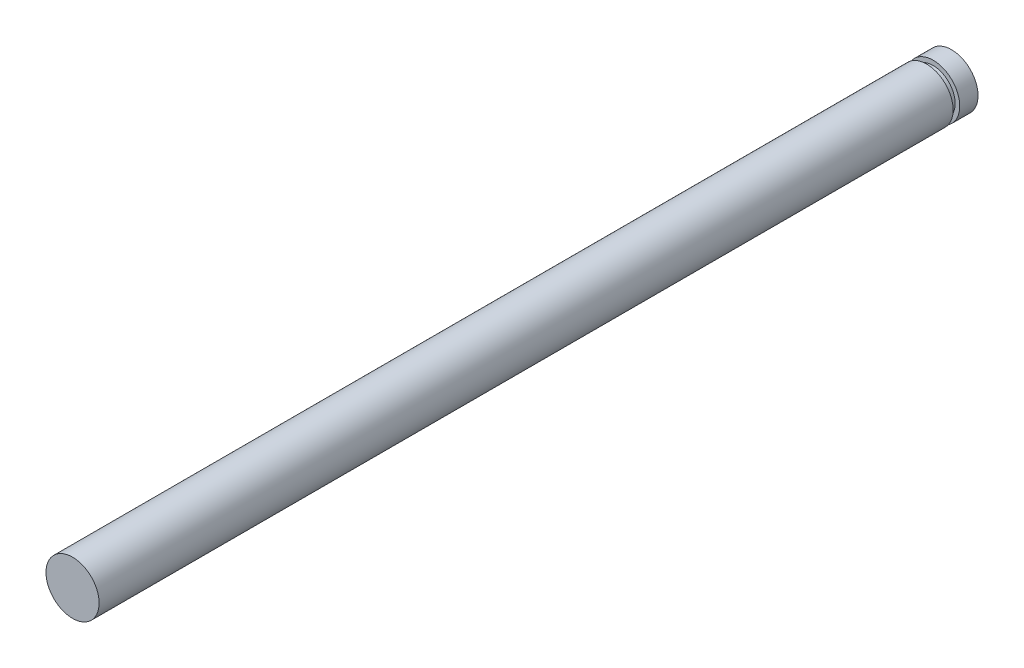
ISO-10303-21;
HEADER;
FILE_DESCRIPTION(('STEP AP214'),'2;1');
FILE_NAME('part.step','',(''),(''),'','','');
FILE_SCHEMA(('AUTOMOTIVE_DESIGN { 1 0 10303 214 1 1 1 1 }'));
ENDSEC;
DATA;
#1=APPLICATION_CONTEXT('core data for automotive mechanical design processes');
#2=APPLICATION_PROTOCOL_DEFINITION('international standard','automotive_design',2000,#1);
#3=PRODUCT_CONTEXT('',#1,'mechanical');
#4=PRODUCT('Part','Part','',(#3));
#5=PRODUCT_RELATED_PRODUCT_CATEGORY('part','',(#4));
#6=PRODUCT_DEFINITION_FORMATION('','',#4);
#7=PRODUCT_DEFINITION_CONTEXT('part definition',#1,'design');
#8=PRODUCT_DEFINITION('design','',#6,#7);
#9=PRODUCT_DEFINITION_SHAPE('','',#8);
#10=(LENGTH_UNIT() NAMED_UNIT(*) SI_UNIT(.MILLI.,.METRE.));
#11=(NAMED_UNIT(*) PLANE_ANGLE_UNIT() SI_UNIT($,.RADIAN.));
#12=(NAMED_UNIT(*) SI_UNIT($,.STERADIAN.) SOLID_ANGLE_UNIT());
#13=UNCERTAINTY_MEASURE_WITH_UNIT(LENGTH_MEASURE(1.E-05),#10,'distance_accuracy_value','');
#14=(GEOMETRIC_REPRESENTATION_CONTEXT(3) GLOBAL_UNCERTAINTY_ASSIGNED_CONTEXT((#13)) GLOBAL_UNIT_ASSIGNED_CONTEXT((#10,
#11,#12)) REPRESENTATION_CONTEXT('',''));
#15=CARTESIAN_POINT('',(0.,0.,0.));
#16=DIRECTION('',(0.,0.,1.));
#17=DIRECTION('',(1.,0.,0.));
#18=AXIS2_PLACEMENT_3D('',#15,#16,#17);
#19=CARTESIAN_POINT('',(0.,0.,-304.8));
#20=DIRECTION('',(0.,0.,-1.));
#21=DIRECTION('',(-1.,0.,0.));
#22=AXIS2_PLACEMENT_3D('',#19,#20,#21);
#23=PLANE('',#22);
#24=CARTESIAN_POINT('',(0.,0.,-304.8));
#25=DIRECTION('',(0.,0.,-1.));
#26=DIRECTION('',(-1.,0.,0.));
#27=AXIS2_PLACEMENT_3D('',#24,#25,#26);
#28=CIRCLE('',#27,18.415);
#29=CARTESIAN_POINT('',(-18.415,0.,-304.8));
#30=VERTEX_POINT('',#29);
#31=EDGE_CURVE('E11',#30,#30,#28,.T.);
#32=ORIENTED_EDGE('',*,*,#31,.T.);
#33=EDGE_LOOP('',(#32));
#34=FACE_BOUND('',#33,.T.);
#35=ADVANCED_FACE('F152',(#34),#23,.T.);
#36=CARTESIAN_POINT('',(0.,0.,-126.274285714286));
#37=DIRECTION('',(0.,0.,-1.));
#38=DIRECTION('',(-1.,0.,0.));
#39=AXIS2_PLACEMENT_3D('',#36,#37,#38);
#40=CYLINDRICAL_SURFACE('',#39,18.415);
#41=CARTESIAN_POINT('',(0.,0.,-292.1));
#42=DIRECTION('',(0.,0.,-1.));
#43=DIRECTION('',(-1.,0.,0.));
#44=AXIS2_PLACEMENT_3D('',#41,#42,#43);
#45=CIRCLE('',#44,18.415);
#46=CARTESIAN_POINT('',(-18.415,0.,-292.1));
#47=VERTEX_POINT('',#46);
#48=EDGE_CURVE('E159',#47,#47,#45,.T.);
#49=ORIENTED_EDGE('',*,*,#48,.T.);
#50=EDGE_LOOP('',(#49));
#51=FACE_BOUND('',#50,.T.);
#52=ORIENTED_EDGE('',*,*,#31,.F.);
#53=EDGE_LOOP('',(#52));
#54=FACE_BOUND('',#53,.T.);
#55=ADVANCED_FACE('F200',(#51,#54),#40,.T.);
#56=CARTESIAN_POINT('',(-1.11022302462516E-13,18.4150000000001,-292.1));
#57=DIRECTION('',(0.,0.,1.));
#58=DIRECTION('',(1.,0.,0.));
#59=AXIS2_PLACEMENT_3D('',#56,#57,#58);
#60=PLANE('',#59);
#61=CARTESIAN_POINT('',(0.,0.,-292.1));
#62=DIRECTION('',(0.,0.,-1.));
#63=DIRECTION('',(-1.,0.,0.));
#64=AXIS2_PLACEMENT_3D('',#61,#62,#63);
#65=CIRCLE('',#64,15.24);
#66=CARTESIAN_POINT('',(-15.24,0.,-292.1));
#67=VERTEX_POINT('',#66);
#68=EDGE_CURVE('E165',#67,#67,#65,.T.);
#69=ORIENTED_EDGE('',*,*,#68,.T.);
#70=EDGE_LOOP('',(#69));
#71=FACE_BOUND('',#70,.T.);
#72=ORIENTED_EDGE('',*,*,#48,.F.);
#73=EDGE_LOOP('',(#72));
#74=FACE_BOUND('',#73,.T.);
#75=ADVANCED_FACE('F203',(#71,#74),#60,.T.);
#76=CARTESIAN_POINT('',(0.,0.,-126.274285714286));
#77=DIRECTION('',(0.,0.,-1.));
#78=DIRECTION('',(-1.,0.,0.));
#79=AXIS2_PLACEMENT_3D('',#76,#77,#78);
#80=CYLINDRICAL_SURFACE('',#79,15.24);
#81=CARTESIAN_POINT('',(0.,0.,-287.528));
#82=DIRECTION('',(0.,0.,-1.));
#83=DIRECTION('',(-1.,0.,0.));
#84=AXIS2_PLACEMENT_3D('',#81,#82,#83);
#85=CIRCLE('',#84,15.24);
#86=CARTESIAN_POINT('',(-15.24,0.,-287.528));
#87=VERTEX_POINT('',#86);
#88=EDGE_CURVE('E173',#87,#87,#85,.T.);
#89=ORIENTED_EDGE('',*,*,#88,.T.);
#90=EDGE_LOOP('',(#89));
#91=FACE_BOUND('',#90,.T.);
#92=ORIENTED_EDGE('',*,*,#68,.F.);
#93=EDGE_LOOP('',(#92));
#94=FACE_BOUND('',#93,.T.);
#95=ADVANCED_FACE('F210',(#91,#94),#80,.T.);
#96=CARTESIAN_POINT('',(-1.11022302462516E-13,15.2399999999999,-287.528));
#97=DIRECTION('',(0.,0.,-1.));
#98=DIRECTION('',(-1.,0.,0.));
#99=AXIS2_PLACEMENT_3D('',#96,#97,#98);
#100=PLANE('',#99);
#101=CARTESIAN_POINT('',(0.,0.,-287.528));
#102=DIRECTION('',(0.,0.,-1.));
#103=DIRECTION('',(-1.,0.,0.));
#104=AXIS2_PLACEMENT_3D('',#101,#102,#103);
#105=CIRCLE('',#104,18.415);
#106=CARTESIAN_POINT('',(-18.415,0.,-287.528));
#107=VERTEX_POINT('',#106);
#108=EDGE_CURVE('E180',#107,#107,#105,.T.);
#109=ORIENTED_EDGE('',*,*,#108,.T.);
#110=EDGE_LOOP('',(#109));
#111=FACE_BOUND('',#110,.T.);
#112=ORIENTED_EDGE('',*,*,#88,.F.);
#113=EDGE_LOOP('',(#112));
#114=FACE_BOUND('',#113,.T.);
#115=ADVANCED_FACE('F197',(#111,#114),#100,.T.);
#116=CARTESIAN_POINT('',(0.,0.,-126.274285714286));
#117=DIRECTION('',(0.,0.,-1.));
#118=DIRECTION('',(-1.,0.,0.));
#119=AXIS2_PLACEMENT_3D('',#116,#117,#118);
#120=CYLINDRICAL_SURFACE('',#119,18.415);
#121=CARTESIAN_POINT('',(0.,0.,304.8));
#122=DIRECTION('',(0.,0.,-1.));
#123=DIRECTION('',(-1.,0.,0.));
#124=AXIS2_PLACEMENT_3D('',#121,#122,#123);
#125=CIRCLE('',#124,18.4149999999999);
#126=CARTESIAN_POINT('',(-18.4149999999999,0.,304.8));
#127=VERTEX_POINT('',#126);
#128=EDGE_CURVE('E181',#127,#127,#125,.T.);
#129=ORIENTED_EDGE('',*,*,#128,.T.);
#130=EDGE_LOOP('',(#129));
#131=FACE_BOUND('',#130,.T.);
#132=ORIENTED_EDGE('',*,*,#108,.F.);
#133=EDGE_LOOP('',(#132));
#134=FACE_BOUND('',#133,.T.);
#135=ADVANCED_FACE('F190',(#131,#134),#120,.T.);
#136=CARTESIAN_POINT('',(1.11022302462516E-13,18.4150000000001,304.8));
#137=DIRECTION('',(0.,0.,1.));
#138=DIRECTION('',(1.,0.,0.));
#139=AXIS2_PLACEMENT_3D('',#136,#137,#138);
#140=PLANE('',#139);
#141=ORIENTED_EDGE('',*,*,#128,.F.);
#142=EDGE_LOOP('',(#141));
#143=FACE_BOUND('',#142,.T.);
#144=ADVANCED_FACE('F189',(#143),#140,.T.);
#145=CLOSED_SHELL('',(#35,#55,#75,#95,#115,#135,#144));
#146=MANIFOLD_SOLID_BREP('B2',#145);
#147=ADVANCED_BREP_SHAPE_REPRESENTATION('',(#18,#146),#14);
#148=SHAPE_DEFINITION_REPRESENTATION(#9,#147);
ENDSEC;
END-ISO-10303-21;
